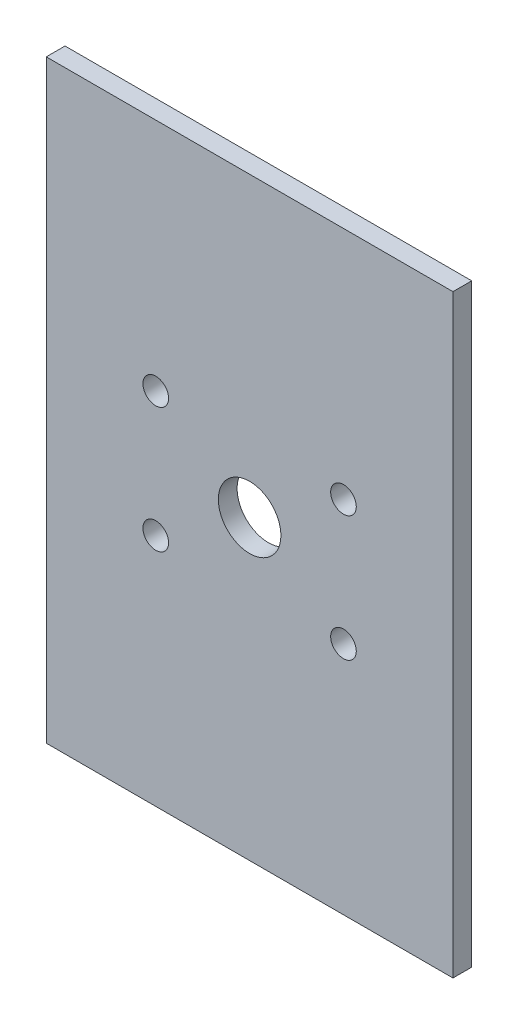
ISO-10303-21;
HEADER;
FILE_DESCRIPTION(('STEP AP214'),'2;1');
FILE_NAME('part.step','',(''),(''),'','','');
FILE_SCHEMA(('AUTOMOTIVE_DESIGN { 1 0 10303 214 1 1 1 1 }'));
ENDSEC;
DATA;
#1=APPLICATION_CONTEXT('core data for automotive mechanical design processes');
#2=APPLICATION_PROTOCOL_DEFINITION('international standard','automotive_design',2000,#1);
#3=PRODUCT_CONTEXT('',#1,'mechanical');
#4=PRODUCT('Part','Part','',(#3));
#5=PRODUCT_RELATED_PRODUCT_CATEGORY('part','',(#4));
#6=PRODUCT_DEFINITION_FORMATION('','',#4);
#7=PRODUCT_DEFINITION_CONTEXT('part definition',#1,'design');
#8=PRODUCT_DEFINITION('design','',#6,#7);
#9=PRODUCT_DEFINITION_SHAPE('','',#8);
#10=(LENGTH_UNIT() NAMED_UNIT(*) SI_UNIT(.MILLI.,.METRE.));
#11=(NAMED_UNIT(*) PLANE_ANGLE_UNIT() SI_UNIT($,.RADIAN.));
#12=(NAMED_UNIT(*) SI_UNIT($,.STERADIAN.) SOLID_ANGLE_UNIT());
#13=UNCERTAINTY_MEASURE_WITH_UNIT(LENGTH_MEASURE(1.E-05),#10,'distance_accuracy_value','');
#14=(GEOMETRIC_REPRESENTATION_CONTEXT(3) GLOBAL_UNCERTAINTY_ASSIGNED_CONTEXT((#13)) GLOBAL_UNIT_ASSIGNED_CONTEXT((#10,
#11,#12)) REPRESENTATION_CONTEXT('',''));
#15=CARTESIAN_POINT('',(0.,0.,0.));
#16=DIRECTION('',(0.,0.,1.));
#17=DIRECTION('',(1.,0.,0.));
#18=AXIS2_PLACEMENT_3D('',#15,#16,#17);
#19=CARTESIAN_POINT('',(65.,95.,6.));
#20=DIRECTION('',(-1.,0.,0.));
#21=DIRECTION('',(0.,-1.,0.));
#22=AXIS2_PLACEMENT_3D('',#19,#20,#21);
#23=PLANE('',#22);
#24=DIRECTION('',(0.,1.,0.));
#25=VECTOR('',#24,1.);
#26=CARTESIAN_POINT('',(65.,95.,0.));
#27=LINE('',#26,#25);
#28=CARTESIAN_POINT('',(65.,-95.,0.));
#29=VERTEX_POINT('',#28);
#30=CARTESIAN_POINT('',(65.,95.,0.));
#31=VERTEX_POINT('',#30);
#32=EDGE_CURVE('E105',#29,#31,#27,.T.);
#33=ORIENTED_EDGE('',*,*,#32,.T.);
#34=DIRECTION('',(0.,0.,-1.));
#35=VECTOR('',#34,1.);
#36=CARTESIAN_POINT('',(65.,95.,6.));
#37=LINE('',#36,#35);
#38=CARTESIAN_POINT('',(65.,95.,6.));
#39=VERTEX_POINT('',#38);
#40=EDGE_CURVE('E11',#39,#31,#37,.T.);
#41=ORIENTED_EDGE('',*,*,#40,.F.);
#42=DIRECTION('',(0.,1.,0.));
#43=VECTOR('',#42,1.);
#44=CARTESIAN_POINT('',(65.,95.,6.));
#45=LINE('',#44,#43);
#46=CARTESIAN_POINT('',(65.,-95.,6.));
#47=VERTEX_POINT('',#46);
#48=EDGE_CURVE('E88',#47,#39,#45,.T.);
#49=ORIENTED_EDGE('',*,*,#48,.F.);
#50=DIRECTION('',(0.,0.,-1.));
#51=VECTOR('',#50,1.);
#52=CARTESIAN_POINT('',(65.,-95.,6.));
#53=LINE('',#52,#51);
#54=EDGE_CURVE('E101',#47,#29,#53,.T.);
#55=ORIENTED_EDGE('',*,*,#54,.T.);
#56=EDGE_LOOP('',(#33,#41,#49,#55));
#57=FACE_BOUND('',#56,.T.);
#58=ADVANCED_FACE('F35',(#57),#23,.F.);
#59=CARTESIAN_POINT('',(-65.,95.,6.));
#60=DIRECTION('',(0.,-1.,0.));
#61=DIRECTION('',(0.,0.,-1.));
#62=AXIS2_PLACEMENT_3D('',#59,#60,#61);
#63=PLANE('',#62);
#64=DIRECTION('',(-1.,0.,0.));
#65=VECTOR('',#64,1.);
#66=CARTESIAN_POINT('',(-65.,95.,0.));
#67=LINE('',#66,#65);
#68=CARTESIAN_POINT('',(-65.,95.,0.));
#69=VERTEX_POINT('',#68);
#70=EDGE_CURVE('E92',#31,#69,#67,.T.);
#71=ORIENTED_EDGE('',*,*,#70,.T.);
#72=DIRECTION('',(0.,0.,-1.));
#73=VECTOR('',#72,1.);
#74=CARTESIAN_POINT('',(-65.,95.,6.));
#75=LINE('',#74,#73);
#76=CARTESIAN_POINT('',(-65.,95.,6.));
#77=VERTEX_POINT('',#76);
#78=EDGE_CURVE('E44',#77,#69,#75,.T.);
#79=ORIENTED_EDGE('',*,*,#78,.F.);
#80=DIRECTION('',(-1.,0.,0.));
#81=VECTOR('',#80,1.);
#82=CARTESIAN_POINT('',(-65.,95.,6.));
#83=LINE('',#82,#81);
#84=EDGE_CURVE('E83',#39,#77,#83,.T.);
#85=ORIENTED_EDGE('',*,*,#84,.F.);
#86=ORIENTED_EDGE('',*,*,#40,.T.);
#87=EDGE_LOOP('',(#71,#79,#85,#86));
#88=FACE_BOUND('',#87,.T.);
#89=ADVANCED_FACE('F91',(#88),#63,.F.);
#90=CARTESIAN_POINT('',(-65.,95.,6.));
#91=DIRECTION('',(1.,0.,0.));
#92=DIRECTION('',(0.,1.,0.));
#93=AXIS2_PLACEMENT_3D('',#90,#91,#92);
#94=PLANE('',#93);
#95=DIRECTION('',(0.,-1.,0.));
#96=VECTOR('',#95,1.);
#97=CARTESIAN_POINT('',(-65.,95.,0.));
#98=LINE('',#97,#96);
#99=CARTESIAN_POINT('',(-65.,-95.,0.));
#100=VERTEX_POINT('',#99);
#101=EDGE_CURVE('E70',#69,#100,#98,.T.);
#102=ORIENTED_EDGE('',*,*,#101,.T.);
#103=DIRECTION('',(0.,0.,-1.));
#104=VECTOR('',#103,1.);
#105=CARTESIAN_POINT('',(-65.,-95.,6.));
#106=LINE('',#105,#104);
#107=CARTESIAN_POINT('',(-65.,-95.,6.));
#108=VERTEX_POINT('',#107);
#109=EDGE_CURVE('E93',#108,#100,#106,.T.);
#110=ORIENTED_EDGE('',*,*,#109,.F.);
#111=DIRECTION('',(0.,-1.,0.));
#112=VECTOR('',#111,1.);
#113=CARTESIAN_POINT('',(-65.,95.,6.));
#114=LINE('',#113,#112);
#115=EDGE_CURVE('E86',#77,#108,#114,.T.);
#116=ORIENTED_EDGE('',*,*,#115,.F.);
#117=ORIENTED_EDGE('',*,*,#78,.T.);
#118=EDGE_LOOP('',(#102,#110,#116,#117));
#119=FACE_BOUND('',#118,.T.);
#120=ADVANCED_FACE('F95',(#119),#94,.F.);
#121=CARTESIAN_POINT('',(-65.,-95.,6.));
#122=DIRECTION('',(0.,1.,0.));
#123=DIRECTION('',(0.,0.,1.));
#124=AXIS2_PLACEMENT_3D('',#121,#122,#123);
#125=PLANE('',#124);
#126=DIRECTION('',(1.,0.,0.));
#127=VECTOR('',#126,1.);
#128=CARTESIAN_POINT('',(-65.,-95.,0.));
#129=LINE('',#128,#127);
#130=EDGE_CURVE('E76',#100,#29,#129,.T.);
#131=ORIENTED_EDGE('',*,*,#130,.T.);
#132=ORIENTED_EDGE('',*,*,#54,.F.);
#133=DIRECTION('',(1.,0.,0.));
#134=VECTOR('',#133,1.);
#135=CARTESIAN_POINT('',(-65.,-95.,6.));
#136=LINE('',#135,#134);
#137=EDGE_CURVE('E53',#108,#47,#136,.T.);
#138=ORIENTED_EDGE('',*,*,#137,.F.);
#139=ORIENTED_EDGE('',*,*,#109,.T.);
#140=EDGE_LOOP('',(#131,#132,#138,#139));
#141=FACE_BOUND('',#140,.T.);
#142=ADVANCED_FACE('F159',(#141),#125,.F.);
#143=CARTESIAN_POINT('',(0.,0.,6.));
#144=DIRECTION('',(0.,0.,1.));
#145=DIRECTION('',(1.,0.,0.));
#146=AXIS2_PLACEMENT_3D('',#143,#144,#145);
#147=PLANE('',#146);
#148=CARTESIAN_POINT('',(-30.,20.,6.));
#149=DIRECTION('',(0.,0.,1.));
#150=DIRECTION('',(1.,0.,0.));
#151=AXIS2_PLACEMENT_3D('',#148,#149,#150);
#152=CIRCLE('',#151,4.09999999999999);
#153=CARTESIAN_POINT('',(-25.9,20.,6.));
#154=VERTEX_POINT('',#153);
#155=EDGE_CURVE('E136',#154,#154,#152,.T.);
#156=ORIENTED_EDGE('',*,*,#155,.F.);
#157=EDGE_LOOP('',(#156));
#158=FACE_BOUND('',#157,.T.);
#159=CARTESIAN_POINT('',(30.,20.,6.));
#160=DIRECTION('',(0.,0.,1.));
#161=DIRECTION('',(1.,0.,0.));
#162=AXIS2_PLACEMENT_3D('',#159,#160,#161);
#163=CIRCLE('',#162,4.09999999999999);
#164=CARTESIAN_POINT('',(34.1,20.,6.));
#165=VERTEX_POINT('',#164);
#166=EDGE_CURVE('E126',#165,#165,#163,.T.);
#167=ORIENTED_EDGE('',*,*,#166,.F.);
#168=EDGE_LOOP('',(#167));
#169=FACE_BOUND('',#168,.T.);
#170=CARTESIAN_POINT('',(30.,-20.,6.));
#171=DIRECTION('',(0.,0.,1.));
#172=DIRECTION('',(1.,0.,0.));
#173=AXIS2_PLACEMENT_3D('',#170,#171,#172);
#174=CIRCLE('',#173,4.09999999999999);
#175=CARTESIAN_POINT('',(34.1,-20.,6.));
#176=VERTEX_POINT('',#175);
#177=EDGE_CURVE('E123',#176,#176,#174,.T.);
#178=ORIENTED_EDGE('',*,*,#177,.F.);
#179=EDGE_LOOP('',(#178));
#180=FACE_BOUND('',#179,.T.);
#181=CARTESIAN_POINT('',(-30.,-20.,6.));
#182=DIRECTION('',(0.,0.,1.));
#183=DIRECTION('',(1.,0.,0.));
#184=AXIS2_PLACEMENT_3D('',#181,#182,#183);
#185=CIRCLE('',#184,4.09999999999999);
#186=CARTESIAN_POINT('',(-25.9,-20.,6.));
#187=VERTEX_POINT('',#186);
#188=EDGE_CURVE('E120',#187,#187,#185,.T.);
#189=ORIENTED_EDGE('',*,*,#188,.F.);
#190=EDGE_LOOP('',(#189));
#191=FACE_BOUND('',#190,.T.);
#192=CARTESIAN_POINT('',(-1.54931956153348E-07,0.,6.));
#193=DIRECTION('',(0.,0.,1.));
#194=DIRECTION('',(1.,0.,0.));
#195=AXIS2_PLACEMENT_3D('',#192,#193,#194);
#196=CIRCLE('',#195,10.);
#197=CARTESIAN_POINT('',(9.99999984506804,0.,6.));
#198=VERTEX_POINT('',#197);
#199=EDGE_CURVE('E119',#198,#198,#196,.T.);
#200=ORIENTED_EDGE('',*,*,#199,.F.);
#201=EDGE_LOOP('',(#200));
#202=FACE_BOUND('',#201,.T.);
#203=ORIENTED_EDGE('',*,*,#48,.T.);
#204=ORIENTED_EDGE('',*,*,#84,.T.);
#205=ORIENTED_EDGE('',*,*,#115,.T.);
#206=ORIENTED_EDGE('',*,*,#137,.T.);
#207=EDGE_LOOP('',(#203,#204,#205,#206));
#208=FACE_BOUND('',#207,.T.);
#209=ADVANCED_FACE('F84',(#158,#169,#180,#191,#202,#208),#147,.T.);
#210=CARTESIAN_POINT('',(0.,0.,0.));
#211=DIRECTION('',(0.,0.,1.));
#212=DIRECTION('',(1.,0.,0.));
#213=AXIS2_PLACEMENT_3D('',#210,#211,#212);
#214=PLANE('',#213);
#215=CARTESIAN_POINT('',(-30.,20.,0.));
#216=DIRECTION('',(0.,0.,1.));
#217=DIRECTION('',(1.,0.,0.));
#218=AXIS2_PLACEMENT_3D('',#215,#216,#217);
#219=CIRCLE('',#218,4.09999999999999);
#220=CARTESIAN_POINT('',(-25.9,20.,0.));
#221=VERTEX_POINT('',#220);
#222=EDGE_CURVE('E38',#221,#221,#219,.T.);
#223=ORIENTED_EDGE('',*,*,#222,.T.);
#224=EDGE_LOOP('',(#223));
#225=FACE_BOUND('',#224,.T.);
#226=CARTESIAN_POINT('',(30.,20.,0.));
#227=DIRECTION('',(0.,0.,1.));
#228=DIRECTION('',(1.,0.,0.));
#229=AXIS2_PLACEMENT_3D('',#226,#227,#228);
#230=CIRCLE('',#229,4.09999999999999);
#231=CARTESIAN_POINT('',(34.1,20.,0.));
#232=VERTEX_POINT('',#231);
#233=EDGE_CURVE('E124',#232,#232,#230,.T.);
#234=ORIENTED_EDGE('',*,*,#233,.T.);
#235=EDGE_LOOP('',(#234));
#236=FACE_BOUND('',#235,.T.);
#237=CARTESIAN_POINT('',(30.,-20.,0.));
#238=DIRECTION('',(0.,0.,1.));
#239=DIRECTION('',(1.,0.,0.));
#240=AXIS2_PLACEMENT_3D('',#237,#238,#239);
#241=CIRCLE('',#240,4.09999999999999);
#242=CARTESIAN_POINT('',(34.1,-20.,0.));
#243=VERTEX_POINT('',#242);
#244=EDGE_CURVE('E121',#243,#243,#241,.T.);
#245=ORIENTED_EDGE('',*,*,#244,.T.);
#246=EDGE_LOOP('',(#245));
#247=FACE_BOUND('',#246,.T.);
#248=CARTESIAN_POINT('',(-30.,-20.,0.));
#249=DIRECTION('',(0.,0.,1.));
#250=DIRECTION('',(1.,0.,0.));
#251=AXIS2_PLACEMENT_3D('',#248,#249,#250);
#252=CIRCLE('',#251,4.09999999999999);
#253=CARTESIAN_POINT('',(-25.9,-20.,0.));
#254=VERTEX_POINT('',#253);
#255=EDGE_CURVE('E116',#254,#254,#252,.T.);
#256=ORIENTED_EDGE('',*,*,#255,.T.);
#257=EDGE_LOOP('',(#256));
#258=FACE_BOUND('',#257,.T.);
#259=CARTESIAN_POINT('',(-1.54931956153348E-07,0.,0.));
#260=DIRECTION('',(0.,0.,1.));
#261=DIRECTION('',(1.,0.,0.));
#262=AXIS2_PLACEMENT_3D('',#259,#260,#261);
#263=CIRCLE('',#262,10.);
#264=CARTESIAN_POINT('',(9.99999984506804,0.,0.));
#265=VERTEX_POINT('',#264);
#266=EDGE_CURVE('E109',#265,#265,#263,.F.);
#267=ORIENTED_EDGE('',*,*,#266,.F.);
#268=EDGE_LOOP('',(#267));
#269=FACE_BOUND('',#268,.T.);
#270=ORIENTED_EDGE('',*,*,#32,.F.);
#271=ORIENTED_EDGE('',*,*,#130,.F.);
#272=ORIENTED_EDGE('',*,*,#101,.F.);
#273=ORIENTED_EDGE('',*,*,#70,.F.);
#274=EDGE_LOOP('',(#270,#271,#272,#273));
#275=FACE_BOUND('',#274,.T.);
#276=ADVANCED_FACE('F152',(#225,#236,#247,#258,#269,#275),#214,.F.);
#277=CARTESIAN_POINT('',(-1.54931956153348E-07,0.,-0.00100000000000013));
#278=DIRECTION('',(0.,0.,1.));
#279=DIRECTION('',(1.,0.,0.));
#280=AXIS2_PLACEMENT_3D('',#277,#278,#279);
#281=CYLINDRICAL_SURFACE('',#280,10.);
#282=CARTESIAN_POINT('',(9.99999984506804,0.,6.));
#283=CARTESIAN_POINT('',(9.99999984506804,0.,5.9375));
#284=CARTESIAN_POINT('',(9.99999984506804,0.,5.875));
#285=CARTESIAN_POINT('',(9.99999984506804,0.,5.75));
#286=CARTESIAN_POINT('',(9.99999984506804,0.,5.6875));
#287=CARTESIAN_POINT('',(9.99999984506804,0.,5.5625));
#288=CARTESIAN_POINT('',(9.99999984506804,0.,5.5));
#289=CARTESIAN_POINT('',(9.99999984506804,0.,5.375));
#290=CARTESIAN_POINT('',(9.99999984506804,0.,5.3125));
#291=CARTESIAN_POINT('',(9.99999984506804,0.,5.1875));
#292=CARTESIAN_POINT('',(9.99999984506804,0.,5.125));
#293=CARTESIAN_POINT('',(9.99999984506804,0.,5.));
#294=CARTESIAN_POINT('',(9.99999984506804,0.,4.9375));
#295=CARTESIAN_POINT('',(9.99999984506804,0.,4.8125));
#296=CARTESIAN_POINT('',(9.99999984506804,0.,4.75));
#297=CARTESIAN_POINT('',(9.99999984506804,0.,4.625));
#298=CARTESIAN_POINT('',(9.99999984506804,0.,4.5625));
#299=CARTESIAN_POINT('',(9.99999984506804,0.,4.4375));
#300=CARTESIAN_POINT('',(9.99999984506804,0.,4.375));
#301=CARTESIAN_POINT('',(9.99999984506804,0.,4.25));
#302=CARTESIAN_POINT('',(9.99999984506804,0.,4.1875));
#303=CARTESIAN_POINT('',(9.99999984506804,0.,4.0625));
#304=CARTESIAN_POINT('',(9.99999984506804,0.,4.));
#305=CARTESIAN_POINT('',(9.99999984506804,0.,3.875));
#306=CARTESIAN_POINT('',(9.99999984506804,0.,3.8125));
#307=CARTESIAN_POINT('',(9.99999984506804,0.,3.6875));
#308=CARTESIAN_POINT('',(9.99999984506804,0.,3.625));
#309=CARTESIAN_POINT('',(9.99999984506804,0.,3.5));
#310=CARTESIAN_POINT('',(9.99999984506804,0.,3.4375));
#311=CARTESIAN_POINT('',(9.99999984506804,0.,3.3125));
#312=CARTESIAN_POINT('',(9.99999984506804,0.,3.25));
#313=CARTESIAN_POINT('',(9.99999984506804,0.,3.125));
#314=CARTESIAN_POINT('',(9.99999984506804,0.,3.0625));
#315=CARTESIAN_POINT('',(9.99999984506804,0.,2.9375));
#316=CARTESIAN_POINT('',(9.99999984506804,0.,2.875));
#317=CARTESIAN_POINT('',(9.99999984506804,0.,2.75));
#318=CARTESIAN_POINT('',(9.99999984506804,0.,2.6875));
#319=CARTESIAN_POINT('',(9.99999984506804,0.,2.5625));
#320=CARTESIAN_POINT('',(9.99999984506804,0.,2.5));
#321=CARTESIAN_POINT('',(9.99999984506804,0.,2.375));
#322=CARTESIAN_POINT('',(9.99999984506804,0.,2.3125));
#323=CARTESIAN_POINT('',(9.99999984506804,0.,2.1875));
#324=CARTESIAN_POINT('',(9.99999984506804,0.,2.125));
#325=CARTESIAN_POINT('',(9.99999984506804,0.,2.));
#326=CARTESIAN_POINT('',(9.99999984506804,0.,1.9375));
#327=CARTESIAN_POINT('',(9.99999984506804,0.,1.8125));
#328=CARTESIAN_POINT('',(9.99999984506804,0.,1.75));
#329=CARTESIAN_POINT('',(9.99999984506804,0.,1.625));
#330=CARTESIAN_POINT('',(9.99999984506804,0.,1.5625));
#331=CARTESIAN_POINT('',(9.99999984506804,0.,1.4375));
#332=CARTESIAN_POINT('',(9.99999984506804,0.,1.375));
#333=CARTESIAN_POINT('',(9.99999984506804,0.,1.25));
#334=CARTESIAN_POINT('',(9.99999984506804,0.,1.1875));
#335=CARTESIAN_POINT('',(9.99999984506804,0.,1.0625));
#336=CARTESIAN_POINT('',(9.99999984506804,0.,1.));
#337=CARTESIAN_POINT('',(9.99999984506804,0.,0.875));
#338=CARTESIAN_POINT('',(9.99999984506804,0.,0.8125));
#339=CARTESIAN_POINT('',(9.99999984506804,0.,0.6875));
#340=CARTESIAN_POINT('',(9.99999984506804,0.,0.625));
#341=CARTESIAN_POINT('',(9.99999984506804,0.,0.5));
#342=CARTESIAN_POINT('',(9.99999984506804,0.,0.4375));
#343=CARTESIAN_POINT('',(9.99999984506804,0.,0.3125));
#344=CARTESIAN_POINT('',(9.99999984506804,0.,0.25));
#345=CARTESIAN_POINT('',(9.99999984506804,0.,0.125));
#346=CARTESIAN_POINT('',(9.99999984506804,0.,0.0625000000000001));
#347=CARTESIAN_POINT('',(9.99999984506804,0.,0.));
#348=B_SPLINE_CURVE_WITH_KNOTS('',3,(#282,#283,#284,#285,#286,#287,#288,#289,#290,#291,#292,
#293,#294,#295,#296,#297,#298,#299,#300,#301,#302,#303,#304,#305,#306,#307,#308,#309,#310,#311,
#312,#313,#314,#315,#316,#317,#318,#319,#320,#321,#322,#323,#324,#325,#326,#327,#328,#329,#330,
#331,#332,#333,#334,#335,#336,#337,#338,#339,#340,#341,#342,#343,#344,#345,#346,#347),
.UNSPECIFIED.,.F.,.F.,(4,2,2,2,2,2,2,2,2,2,2,2,2,2,2,2,2,2,2,2,2,2,2,2,2,2,2,2,2,2,2,2,4),(0.,
0.1875,0.375,0.5625,0.75,0.9375,1.125,1.3125,1.5,1.6875,1.875,2.0625,2.25,2.4375,2.625,2.8125,
3.,3.1875,3.375,3.5625,3.75,3.9375,4.125,4.3125,4.5,4.6875,4.875,5.0625,5.25,5.4375,5.625,
5.8125,6.),.UNSPECIFIED.);
#349=EDGE_CURVE('BSEAM150',#198,#265,#348,.T.);
#350=ORIENTED_EDGE('',*,*,#199,.T.);
#351=ORIENTED_EDGE('',*,*,#266,.T.);
#352=ORIENTED_EDGE('',*,*,#349,.T.);
#353=ORIENTED_EDGE('',*,*,#349,.F.);
#354=EDGE_LOOP('',(#350,#352,#351,#353));
#355=FACE_BOUND('',#354,.T.);
#356=ADVANCED_FACE('F150',(#355),#281,.F.);
#357=CARTESIAN_POINT('',(-30.,-20.,6.));
#358=DIRECTION('',(0.,0.,1.));
#359=DIRECTION('',(1.,0.,0.));
#360=AXIS2_PLACEMENT_3D('',#357,#358,#359);
#361=CYLINDRICAL_SURFACE('',#360,4.09999999999999);
#362=ORIENTED_EDGE('',*,*,#188,.T.);
#363=EDGE_LOOP('',(#362));
#364=FACE_BOUND('',#363,.T.);
#365=ORIENTED_EDGE('',*,*,#255,.F.);
#366=EDGE_LOOP('',(#365));
#367=FACE_BOUND('',#366,.T.);
#368=ADVANCED_FACE('F196',(#364,#367),#361,.F.);
#369=CARTESIAN_POINT('',(30.,-20.,6.));
#370=DIRECTION('',(0.,0.,1.));
#371=DIRECTION('',(1.,0.,0.));
#372=AXIS2_PLACEMENT_3D('',#369,#370,#371);
#373=CYLINDRICAL_SURFACE('',#372,4.09999999999999);
#374=ORIENTED_EDGE('',*,*,#177,.T.);
#375=EDGE_LOOP('',(#374));
#376=FACE_BOUND('',#375,.T.);
#377=ORIENTED_EDGE('',*,*,#244,.F.);
#378=EDGE_LOOP('',(#377));
#379=FACE_BOUND('',#378,.T.);
#380=ADVANCED_FACE('F216',(#376,#379),#373,.F.);
#381=CARTESIAN_POINT('',(30.,20.,6.));
#382=DIRECTION('',(0.,0.,1.));
#383=DIRECTION('',(1.,0.,0.));
#384=AXIS2_PLACEMENT_3D('',#381,#382,#383);
#385=CYLINDRICAL_SURFACE('',#384,4.09999999999999);
#386=ORIENTED_EDGE('',*,*,#166,.T.);
#387=EDGE_LOOP('',(#386));
#388=FACE_BOUND('',#387,.T.);
#389=ORIENTED_EDGE('',*,*,#233,.F.);
#390=EDGE_LOOP('',(#389));
#391=FACE_BOUND('',#390,.T.);
#392=ADVANCED_FACE('F208',(#388,#391),#385,.F.);
#393=CARTESIAN_POINT('',(-30.,20.,6.));
#394=DIRECTION('',(0.,0.,1.));
#395=DIRECTION('',(1.,0.,0.));
#396=AXIS2_PLACEMENT_3D('',#393,#394,#395);
#397=CYLINDRICAL_SURFACE('',#396,4.09999999999999);
#398=ORIENTED_EDGE('',*,*,#155,.T.);
#399=EDGE_LOOP('',(#398));
#400=FACE_BOUND('',#399,.T.);
#401=ORIENTED_EDGE('',*,*,#222,.F.);
#402=EDGE_LOOP('',(#401));
#403=FACE_BOUND('',#402,.T.);
#404=ADVANCED_FACE('F203',(#400,#403),#397,.F.);
#405=CLOSED_SHELL('',(#58,#89,#120,#142,#209,#276,#356,#368,#380,#392,#404));
#406=MANIFOLD_SOLID_BREP('B2',#405);
#407=ADVANCED_BREP_SHAPE_REPRESENTATION('',(#18,#406),#14);
#408=SHAPE_DEFINITION_REPRESENTATION(#9,#407);
ENDSEC;
END-ISO-10303-21;
